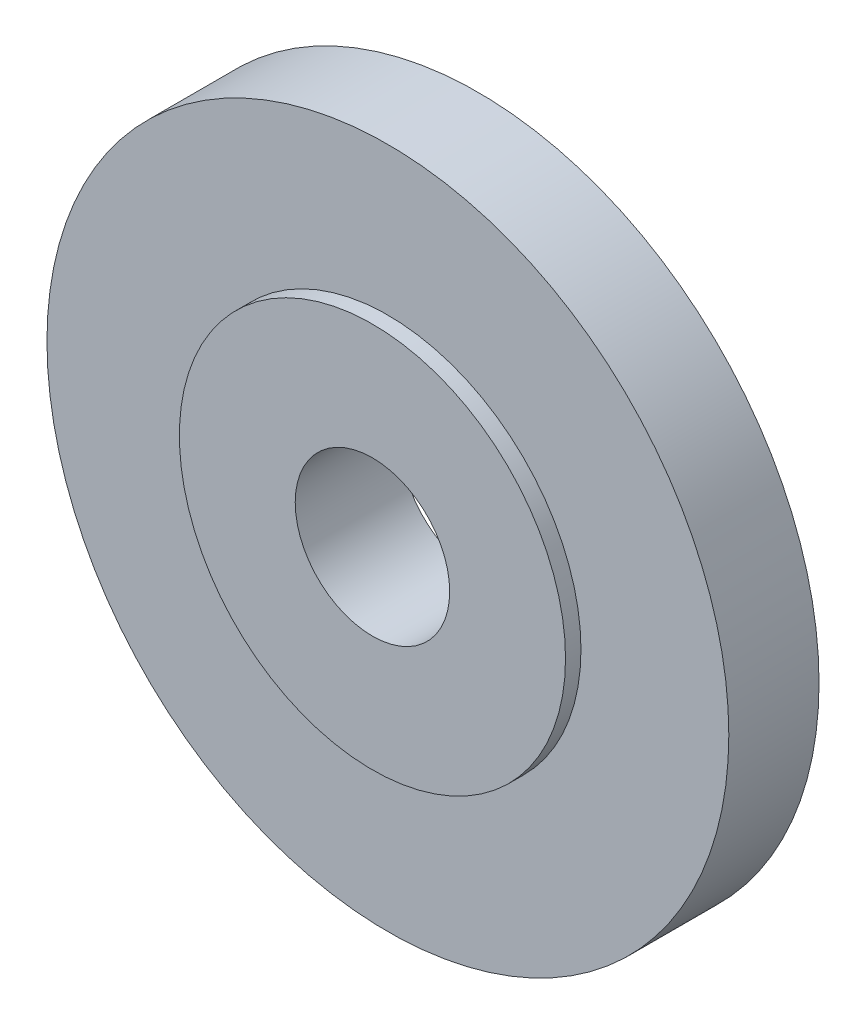
ISO-10303-21;
HEADER;
FILE_DESCRIPTION(('STEP AP214'),'2;1');
FILE_NAME('part.step','',(''),(''),'','','');
FILE_SCHEMA(('AUTOMOTIVE_DESIGN { 1 0 10303 214 1 1 1 1 }'));
ENDSEC;
DATA;
#1=APPLICATION_CONTEXT('core data for automotive mechanical design processes');
#2=APPLICATION_PROTOCOL_DEFINITION('international standard','automotive_design',2000,#1);
#3=PRODUCT_CONTEXT('',#1,'mechanical');
#4=PRODUCT('Part','Part','',(#3));
#5=PRODUCT_RELATED_PRODUCT_CATEGORY('part','',(#4));
#6=PRODUCT_DEFINITION_FORMATION('','',#4);
#7=PRODUCT_DEFINITION_CONTEXT('part definition',#1,'design');
#8=PRODUCT_DEFINITION('design','',#6,#7);
#9=PRODUCT_DEFINITION_SHAPE('','',#8);
#10=(LENGTH_UNIT() NAMED_UNIT(*) SI_UNIT(.MILLI.,.METRE.));
#11=(NAMED_UNIT(*) PLANE_ANGLE_UNIT() SI_UNIT($,.RADIAN.));
#12=(NAMED_UNIT(*) SI_UNIT($,.STERADIAN.) SOLID_ANGLE_UNIT());
#13=UNCERTAINTY_MEASURE_WITH_UNIT(LENGTH_MEASURE(1.E-05),#10,'distance_accuracy_value','');
#14=(GEOMETRIC_REPRESENTATION_CONTEXT(3) GLOBAL_UNCERTAINTY_ASSIGNED_CONTEXT((#13)) GLOBAL_UNIT_ASSIGNED_CONTEXT((#10,
#11,#12)) REPRESENTATION_CONTEXT('',''));
#15=CARTESIAN_POINT('',(0.,0.,0.));
#16=DIRECTION('',(0.,0.,1.));
#17=DIRECTION('',(1.,0.,0.));
#18=AXIS2_PLACEMENT_3D('',#15,#16,#17);
#19=CARTESIAN_POINT('',(0.,0.,10.));
#20=DIRECTION('',(0.,0.,1.));
#21=DIRECTION('',(1.,0.,0.));
#22=AXIS2_PLACEMENT_3D('',#19,#20,#21);
#23=PLANE('',#22);
#24=CARTESIAN_POINT('',(0.,0.,10.));
#25=DIRECTION('',(0.,0.,1.));
#26=DIRECTION('',(1.,0.,0.));
#27=AXIS2_PLACEMENT_3D('',#24,#25,#26);
#28=CIRCLE('',#27,125.);
#29=CARTESIAN_POINT('',(125.,0.,10.));
#30=VERTEX_POINT('',#29);
#31=EDGE_CURVE('E12',#30,#30,#28,.T.);
#32=ORIENTED_EDGE('',*,*,#31,.T.);
#33=EDGE_LOOP('',(#32));
#34=FACE_BOUND('',#33,.T.);
#35=CARTESIAN_POINT('',(0.,0.,10.));
#36=DIRECTION('',(0.,0.,1.));
#37=DIRECTION('',(1.,0.,0.));
#38=AXIS2_PLACEMENT_3D('',#35,#36,#37);
#39=CIRCLE('',#38,50.);
#40=CARTESIAN_POINT('',(50.,0.,10.));
#41=VERTEX_POINT('',#40);
#42=EDGE_CURVE('E53',#41,#41,#39,.T.);
#43=ORIENTED_EDGE('',*,*,#42,.F.);
#44=EDGE_LOOP('',(#43));
#45=FACE_BOUND('',#44,.T.);
#46=ADVANCED_FACE('F45',(#34,#45),#23,.T.);
#47=CARTESIAN_POINT('',(0.,0.,10.));
#48=DIRECTION('',(0.,0.,-1.));
#49=DIRECTION('',(-1.,0.,0.));
#50=AXIS2_PLACEMENT_3D('',#47,#48,#49);
#51=CYLINDRICAL_SURFACE('',#50,125.);
#52=ORIENTED_EDGE('',*,*,#31,.F.);
#53=EDGE_LOOP('',(#52));
#54=FACE_BOUND('',#53,.T.);
#55=CARTESIAN_POINT('',(0.,0.,0.));
#56=DIRECTION('',(0.,0.,1.));
#57=DIRECTION('',(1.,0.,0.));
#58=AXIS2_PLACEMENT_3D('',#55,#56,#57);
#59=CIRCLE('',#58,125.);
#60=CARTESIAN_POINT('',(125.,0.,0.));
#61=VERTEX_POINT('',#60);
#62=EDGE_CURVE('E49',#61,#61,#59,.T.);
#63=ORIENTED_EDGE('',*,*,#62,.T.);
#64=EDGE_LOOP('',(#63));
#65=FACE_BOUND('',#64,.T.);
#66=ADVANCED_FACE('F47',(#54,#65),#51,.T.);
#67=CARTESIAN_POINT('',(0.,0.,10.));
#68=DIRECTION('',(0.,0.,-1.));
#69=DIRECTION('',(-1.,0.,0.));
#70=AXIS2_PLACEMENT_3D('',#67,#68,#69);
#71=CYLINDRICAL_SURFACE('',#70,50.);
#72=ORIENTED_EDGE('',*,*,#42,.T.);
#73=EDGE_LOOP('',(#72));
#74=FACE_BOUND('',#73,.T.);
#75=CARTESIAN_POINT('',(0.,0.,-58.41));
#76=DIRECTION('',(0.,0.,-1.));
#77=DIRECTION('',(-1.,0.,0.));
#78=AXIS2_PLACEMENT_3D('',#75,#76,#77);
#79=CIRCLE('',#78,50.);
#80=CARTESIAN_POINT('',(-50.,0.,-58.41));
#81=VERTEX_POINT('',#80);
#82=EDGE_CURVE('E63',#81,#81,#79,.F.);
#83=ORIENTED_EDGE('',*,*,#82,.F.);
#84=EDGE_LOOP('',(#83));
#85=FACE_BOUND('',#84,.T.);
#86=ADVANCED_FACE('F75',(#74,#85),#71,.F.);
#87=CARTESIAN_POINT('',(0.,0.,-58.41));
#88=DIRECTION('',(0.,0.,1.));
#89=DIRECTION('',(1.,0.,0.));
#90=AXIS2_PLACEMENT_3D('',#87,#88,#89);
#91=CYLINDRICAL_SURFACE('',#90,220.72);
#92=CARTESIAN_POINT('',(0.,0.,-58.41));
#93=DIRECTION('',(0.,0.,-1.));
#94=DIRECTION('',(-1.,0.,0.));
#95=AXIS2_PLACEMENT_3D('',#92,#93,#94);
#96=CIRCLE('',#95,220.72);
#97=CARTESIAN_POINT('',(-220.72,0.,-58.41));
#98=VERTEX_POINT('',#97);
#99=EDGE_CURVE('E62',#98,#98,#96,.T.);
#100=ORIENTED_EDGE('',*,*,#99,.F.);
#101=EDGE_LOOP('',(#100));
#102=FACE_BOUND('',#101,.T.);
#103=CARTESIAN_POINT('',(0.,0.,0.));
#104=DIRECTION('',(0.,0.,-1.));
#105=DIRECTION('',(-1.,0.,0.));
#106=AXIS2_PLACEMENT_3D('',#103,#104,#105);
#107=CIRCLE('',#106,220.72);
#108=CARTESIAN_POINT('',(-220.72,0.,0.));
#109=VERTEX_POINT('',#108);
#110=EDGE_CURVE('E59',#109,#109,#107,.T.);
#111=ORIENTED_EDGE('',*,*,#110,.T.);
#112=EDGE_LOOP('',(#111));
#113=FACE_BOUND('',#112,.T.);
#114=ADVANCED_FACE('F72',(#102,#113),#91,.T.);
#115=CARTESIAN_POINT('',(0.,0.,-58.41));
#116=DIRECTION('',(0.,0.,-1.));
#117=DIRECTION('',(-1.,0.,0.));
#118=AXIS2_PLACEMENT_3D('',#115,#116,#117);
#119=PLANE('',#118);
#120=ORIENTED_EDGE('',*,*,#99,.T.);
#121=EDGE_LOOP('',(#120));
#122=FACE_BOUND('',#121,.T.);
#123=ORIENTED_EDGE('',*,*,#82,.T.);
#124=EDGE_LOOP('',(#123));
#125=FACE_BOUND('',#124,.T.);
#126=ADVANCED_FACE('F69',(#122,#125),#119,.T.);
#127=CARTESIAN_POINT('',(0.,0.,0.));
#128=DIRECTION('',(0.,0.,-1.));
#129=DIRECTION('',(-1.,0.,0.));
#130=AXIS2_PLACEMENT_3D('',#127,#128,#129);
#131=PLANE('',#130);
#132=ORIENTED_EDGE('',*,*,#62,.F.);
#133=EDGE_LOOP('',(#132));
#134=FACE_BOUND('',#133,.T.);
#135=ORIENTED_EDGE('',*,*,#110,.F.);
#136=EDGE_LOOP('',(#135));
#137=FACE_BOUND('',#136,.T.);
#138=ADVANCED_FACE('F79',(#134,#137),#131,.F.);
#139=CLOSED_SHELL('',(#46,#66,#86,#114,#126,#138));
#140=MANIFOLD_SOLID_BREP('B2',#139);
#141=ADVANCED_BREP_SHAPE_REPRESENTATION('',(#18,#140),#14);
#142=SHAPE_DEFINITION_REPRESENTATION(#9,#141);
ENDSEC;
END-ISO-10303-21;
